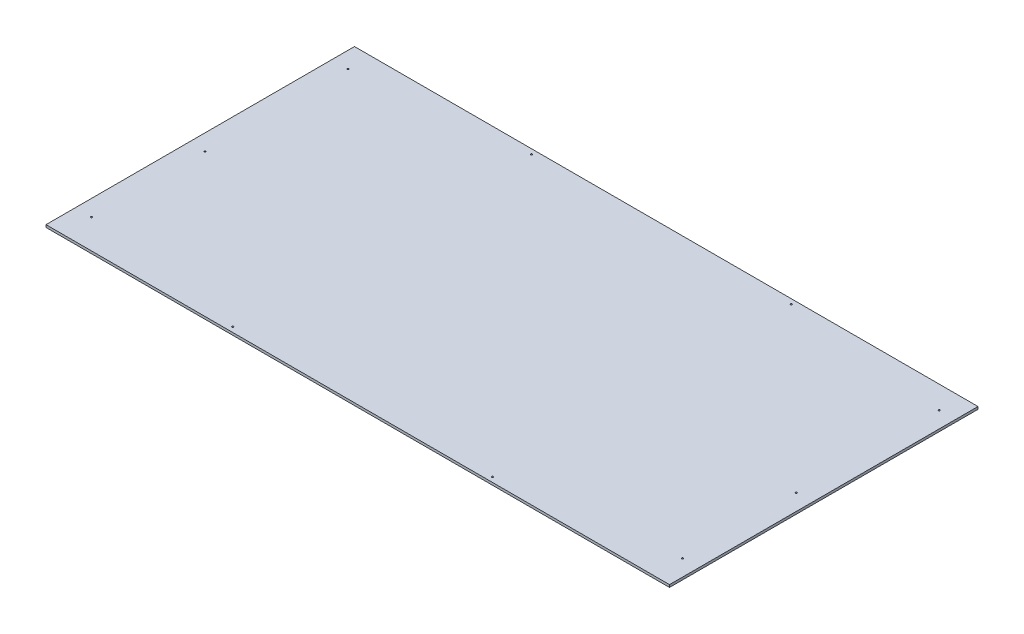
ISO-10303-21;
HEADER;
FILE_DESCRIPTION(('STEP AP214'),'2;1');
FILE_NAME('part.step','',(''),(''),'','','');
FILE_SCHEMA(('AUTOMOTIVE_DESIGN { 1 0 10303 214 1 1 1 1 }'));
ENDSEC;
DATA;
#1=APPLICATION_CONTEXT('core data for automotive mechanical design processes');
#2=APPLICATION_PROTOCOL_DEFINITION('international standard','automotive_design',2000,#1);
#3=PRODUCT_CONTEXT('',#1,'mechanical');
#4=PRODUCT('Part','Part','',(#3));
#5=PRODUCT_RELATED_PRODUCT_CATEGORY('part','',(#4));
#6=PRODUCT_DEFINITION_FORMATION('','',#4);
#7=PRODUCT_DEFINITION_CONTEXT('part definition',#1,'design');
#8=PRODUCT_DEFINITION('design','',#6,#7);
#9=PRODUCT_DEFINITION_SHAPE('','',#8);
#10=(LENGTH_UNIT() NAMED_UNIT(*) SI_UNIT(.MILLI.,.METRE.));
#11=(NAMED_UNIT(*) PLANE_ANGLE_UNIT() SI_UNIT($,.RADIAN.));
#12=(NAMED_UNIT(*) SI_UNIT($,.STERADIAN.) SOLID_ANGLE_UNIT());
#13=UNCERTAINTY_MEASURE_WITH_UNIT(LENGTH_MEASURE(1.E-05),#10,'distance_accuracy_value','');
#14=(GEOMETRIC_REPRESENTATION_CONTEXT(3) GLOBAL_UNCERTAINTY_ASSIGNED_CONTEXT((#13)) GLOBAL_UNIT_ASSIGNED_CONTEXT((#10,
#11,#12)) REPRESENTATION_CONTEXT('',''));
#15=CARTESIAN_POINT('',(0.,0.,0.));
#16=DIRECTION('',(0.,0.,1.));
#17=DIRECTION('',(1.,0.,0.));
#18=AXIS2_PLACEMENT_3D('',#15,#16,#17);
#19=CARTESIAN_POINT('',(0.,42.926,0.));
#20=DIRECTION('',(0.,1.,0.));
#21=DIRECTION('',(0.,0.,1.));
#22=AXIS2_PLACEMENT_3D('',#19,#20,#21);
#23=PLANE('',#22);
#24=CARTESIAN_POINT('',(254.,42.926,473.075));
#25=DIRECTION('',(0.,1.,0.));
#26=DIRECTION('',(0.,0.,1.));
#27=AXIS2_PLACEMENT_3D('',#24,#25,#26);
#28=CIRCLE('',#27,1.5875);
#29=CARTESIAN_POINT('',(254.,42.926,474.6625));
#30=VERTEX_POINT('',#29);
#31=EDGE_CURVE('E109',#30,#30,#28,.F.);
#32=ORIENTED_EDGE('',*,*,#31,.T.);
#33=EDGE_LOOP('',(#32));
#34=FACE_BOUND('',#33,.T.);
#35=CARTESIAN_POINT('',(-254.,42.926,473.075));
#36=DIRECTION('',(0.,1.,0.));
#37=DIRECTION('',(0.,0.,1.));
#38=AXIS2_PLACEMENT_3D('',#35,#36,#37);
#39=CIRCLE('',#38,1.5875);
#40=CARTESIAN_POINT('',(-254.,42.926,474.6625));
#41=VERTEX_POINT('',#40);
#42=EDGE_CURVE('E112',#41,#41,#39,.F.);
#43=ORIENTED_EDGE('',*,*,#42,.T.);
#44=EDGE_LOOP('',(#43));
#45=FACE_BOUND('',#44,.T.);
#46=CARTESIAN_POINT('',(-254.,42.926,1057.275));
#47=DIRECTION('',(0.,1.,0.));
#48=DIRECTION('',(0.,0.,1.));
#49=AXIS2_PLACEMENT_3D('',#46,#47,#48);
#50=CIRCLE('',#49,1.5875);
#51=CARTESIAN_POINT('',(-254.,42.926,1058.8625));
#52=VERTEX_POINT('',#51);
#53=EDGE_CURVE('E115',#52,#52,#50,.F.);
#54=ORIENTED_EDGE('',*,*,#53,.T.);
#55=EDGE_LOOP('',(#54));
#56=FACE_BOUND('',#55,.T.);
#57=CARTESIAN_POINT('',(254.,42.926,1057.275));
#58=DIRECTION('',(0.,1.,0.));
#59=DIRECTION('',(0.,0.,1.));
#60=AXIS2_PLACEMENT_3D('',#57,#58,#59);
#61=CIRCLE('',#60,1.5875);
#62=CARTESIAN_POINT('',(254.,42.926,1058.8625));
#63=VERTEX_POINT('',#62);
#64=EDGE_CURVE('E118',#63,#63,#61,.F.);
#65=ORIENTED_EDGE('',*,*,#64,.T.);
#66=EDGE_LOOP('',(#65));
#67=FACE_BOUND('',#66,.T.);
#68=CARTESIAN_POINT('',(-577.85,42.926,1009.65));
#69=DIRECTION('',(0.,1.,0.));
#70=DIRECTION('',(0.,0.,1.));
#71=AXIS2_PLACEMENT_3D('',#68,#69,#70);
#72=CIRCLE('',#71,1.5875);
#73=CARTESIAN_POINT('',(-577.85,42.926,1011.2375));
#74=VERTEX_POINT('',#73);
#75=EDGE_CURVE('E121',#74,#74,#72,.F.);
#76=ORIENTED_EDGE('',*,*,#75,.T.);
#77=EDGE_LOOP('',(#76));
#78=FACE_BOUND('',#77,.T.);
#79=CARTESIAN_POINT('',(-577.85,42.926,787.4));
#80=DIRECTION('',(0.,1.,0.));
#81=DIRECTION('',(0.,0.,1.));
#82=AXIS2_PLACEMENT_3D('',#79,#80,#81);
#83=CIRCLE('',#82,1.5875);
#84=CARTESIAN_POINT('',(-577.85,42.926,788.9875));
#85=VERTEX_POINT('',#84);
#86=EDGE_CURVE('E124',#85,#85,#83,.F.);
#87=ORIENTED_EDGE('',*,*,#86,.T.);
#88=EDGE_LOOP('',(#87));
#89=FACE_BOUND('',#88,.T.);
#90=CARTESIAN_POINT('',(-577.85,42.926,508.));
#91=DIRECTION('',(0.,1.,0.));
#92=DIRECTION('',(0.,0.,1.));
#93=AXIS2_PLACEMENT_3D('',#90,#91,#92);
#94=CIRCLE('',#93,1.5875);
#95=CARTESIAN_POINT('',(-577.85,42.926,509.5875));
#96=VERTEX_POINT('',#95);
#97=EDGE_CURVE('E127',#96,#96,#94,.F.);
#98=ORIENTED_EDGE('',*,*,#97,.T.);
#99=EDGE_LOOP('',(#98));
#100=FACE_BOUND('',#99,.T.);
#101=CARTESIAN_POINT('',(577.85,42.926,787.4));
#102=DIRECTION('',(0.,1.,0.));
#103=DIRECTION('',(0.,0.,1.));
#104=AXIS2_PLACEMENT_3D('',#101,#102,#103);
#105=CIRCLE('',#104,1.5875);
#106=CARTESIAN_POINT('',(577.85,42.926,788.9875));
#107=VERTEX_POINT('',#106);
#108=EDGE_CURVE('E130',#107,#107,#105,.F.);
#109=ORIENTED_EDGE('',*,*,#108,.T.);
#110=EDGE_LOOP('',(#109));
#111=FACE_BOUND('',#110,.T.);
#112=CARTESIAN_POINT('',(577.85,42.926,508.));
#113=DIRECTION('',(0.,1.,0.));
#114=DIRECTION('',(0.,0.,1.));
#115=AXIS2_PLACEMENT_3D('',#112,#113,#114);
#116=CIRCLE('',#115,1.5875);
#117=CARTESIAN_POINT('',(577.85,42.926,509.5875));
#118=VERTEX_POINT('',#117);
#119=EDGE_CURVE('E132',#118,#118,#116,.F.);
#120=ORIENTED_EDGE('',*,*,#119,.T.);
#121=EDGE_LOOP('',(#120));
#122=FACE_BOUND('',#121,.T.);
#123=CARTESIAN_POINT('',(577.85,42.926,1009.65));
#124=DIRECTION('',(0.,1.,0.));
#125=DIRECTION('',(0.,0.,1.));
#126=AXIS2_PLACEMENT_3D('',#123,#124,#125);
#127=CIRCLE('',#126,1.5875);
#128=CARTESIAN_POINT('',(577.85,42.926,1011.2375));
#129=VERTEX_POINT('',#128);
#130=EDGE_CURVE('E19',#129,#129,#127,.F.);
#131=ORIENTED_EDGE('',*,*,#130,.T.);
#132=EDGE_LOOP('',(#131));
#133=FACE_BOUND('',#132,.T.);
#134=DIRECTION('',(1.,0.,0.));
#135=VECTOR('',#134,1.);
#136=CARTESIAN_POINT('',(-609.6,42.926,1066.8));
#137=LINE('',#136,#135);
#138=CARTESIAN_POINT('',(609.6,42.926,1066.8));
#139=VERTEX_POINT('',#138);
#140=CARTESIAN_POINT('',(-609.6,42.926,1066.8));
#141=VERTEX_POINT('',#140);
#142=EDGE_CURVE('E70',#139,#141,#137,.F.);
#143=ORIENTED_EDGE('',*,*,#142,.F.);
#144=DIRECTION('',(0.,0.,-1.));
#145=VECTOR('',#144,1.);
#146=CARTESIAN_POINT('',(609.6,42.926,1066.8));
#147=LINE('',#146,#145);
#148=CARTESIAN_POINT('',(609.6,42.926,463.55));
#149=VERTEX_POINT('',#148);
#150=EDGE_CURVE('E67',#149,#139,#147,.F.);
#151=ORIENTED_EDGE('',*,*,#150,.F.);
#152=DIRECTION('',(-1.,0.,0.));
#153=VECTOR('',#152,1.);
#154=CARTESIAN_POINT('',(609.6,42.926,463.55));
#155=LINE('',#154,#153);
#156=CARTESIAN_POINT('',(-609.6,42.926,463.55));
#157=VERTEX_POINT('',#156);
#158=EDGE_CURVE('E58',#157,#149,#155,.F.);
#159=ORIENTED_EDGE('',*,*,#158,.F.);
#160=DIRECTION('',(0.,0.,1.));
#161=VECTOR('',#160,1.);
#162=CARTESIAN_POINT('',(-609.6,42.926,463.55));
#163=LINE('',#162,#161);
#164=EDGE_CURVE('E53',#141,#157,#163,.F.);
#165=ORIENTED_EDGE('',*,*,#164,.F.);
#166=EDGE_LOOP('',(#143,#151,#159,#165));
#167=FACE_BOUND('',#166,.T.);
#168=ADVANCED_FACE('F16',(#34,#45,#56,#67,#78,#89,#100,#111,#122,#133,#167),#23,.T.);
#169=CARTESIAN_POINT('',(609.6,38.1,1066.8));
#170=DIRECTION('',(1.,0.,0.));
#171=DIRECTION('',(0.,0.,-1.));
#172=AXIS2_PLACEMENT_3D('',#169,#170,#171);
#173=PLANE('',#172);
#174=DIRECTION('',(0.,1.,0.));
#175=VECTOR('',#174,1.);
#176=CARTESIAN_POINT('',(609.6,38.1,1066.8));
#177=LINE('',#176,#175);
#178=CARTESIAN_POINT('',(609.6,38.1,1066.8));
#179=VERTEX_POINT('',#178);
#180=EDGE_CURVE('E140',#179,#139,#177,.T.);
#181=ORIENTED_EDGE('',*,*,#180,.F.);
#182=DIRECTION('',(0.,0.,1.));
#183=VECTOR('',#182,1.);
#184=CARTESIAN_POINT('',(609.6,38.1,0.));
#185=LINE('',#184,#183);
#186=CARTESIAN_POINT('',(609.6,38.1,463.55));
#187=VERTEX_POINT('',#186);
#188=EDGE_CURVE('E77',#179,#187,#185,.F.);
#189=ORIENTED_EDGE('',*,*,#188,.T.);
#190=DIRECTION('',(0.,1.,0.));
#191=VECTOR('',#190,1.);
#192=CARTESIAN_POINT('',(609.6,38.1,463.55));
#193=LINE('',#192,#191);
#194=EDGE_CURVE('E63',#149,#187,#193,.F.);
#195=ORIENTED_EDGE('',*,*,#194,.F.);
#196=ORIENTED_EDGE('',*,*,#150,.T.);
#197=EDGE_LOOP('',(#181,#189,#195,#196));
#198=FACE_BOUND('',#197,.T.);
#199=ADVANCED_FACE('F76',(#198),#173,.T.);
#200=CARTESIAN_POINT('',(609.6,38.1,463.55));
#201=DIRECTION('',(0.,0.,-1.));
#202=DIRECTION('',(-1.,0.,0.));
#203=AXIS2_PLACEMENT_3D('',#200,#201,#202);
#204=PLANE('',#203);
#205=ORIENTED_EDGE('',*,*,#194,.T.);
#206=DIRECTION('',(1.,0.,0.));
#207=VECTOR('',#206,1.);
#208=CARTESIAN_POINT('',(0.,38.1,463.55));
#209=LINE('',#208,#207);
#210=CARTESIAN_POINT('',(-609.6,38.1,463.55));
#211=VERTEX_POINT('',#210);
#212=EDGE_CURVE('E151',#187,#211,#209,.F.);
#213=ORIENTED_EDGE('',*,*,#212,.T.);
#214=DIRECTION('',(0.,1.,0.));
#215=VECTOR('',#214,1.);
#216=CARTESIAN_POINT('',(-609.6,38.1,463.55));
#217=LINE('',#216,#215);
#218=EDGE_CURVE('E65',#157,#211,#217,.F.);
#219=ORIENTED_EDGE('',*,*,#218,.F.);
#220=ORIENTED_EDGE('',*,*,#158,.T.);
#221=EDGE_LOOP('',(#205,#213,#219,#220));
#222=FACE_BOUND('',#221,.T.);
#223=ADVANCED_FACE('F60',(#222),#204,.T.);
#224=CARTESIAN_POINT('',(-609.6,38.1,463.55));
#225=DIRECTION('',(-1.,0.,0.));
#226=DIRECTION('',(0.,0.,1.));
#227=AXIS2_PLACEMENT_3D('',#224,#225,#226);
#228=PLANE('',#227);
#229=ORIENTED_EDGE('',*,*,#218,.T.);
#230=DIRECTION('',(0.,0.,1.));
#231=VECTOR('',#230,1.);
#232=CARTESIAN_POINT('',(-609.6,38.1,0.));
#233=LINE('',#232,#231);
#234=CARTESIAN_POINT('',(-609.6,38.1,1066.8));
#235=VERTEX_POINT('',#234);
#236=EDGE_CURVE('E148',#211,#235,#233,.T.);
#237=ORIENTED_EDGE('',*,*,#236,.T.);
#238=DIRECTION('',(0.,1.,0.));
#239=VECTOR('',#238,1.);
#240=CARTESIAN_POINT('',(-609.6,38.1,1066.8));
#241=LINE('',#240,#239);
#242=EDGE_CURVE('E34',#141,#235,#241,.F.);
#243=ORIENTED_EDGE('',*,*,#242,.F.);
#244=ORIENTED_EDGE('',*,*,#164,.T.);
#245=EDGE_LOOP('',(#229,#237,#243,#244));
#246=FACE_BOUND('',#245,.T.);
#247=ADVANCED_FACE('F147',(#246),#228,.T.);
#248=CARTESIAN_POINT('',(-609.6,38.1,1066.8));
#249=DIRECTION('',(0.,0.,1.));
#250=DIRECTION('',(1.,0.,0.));
#251=AXIS2_PLACEMENT_3D('',#248,#249,#250);
#252=PLANE('',#251);
#253=ORIENTED_EDGE('',*,*,#242,.T.);
#254=DIRECTION('',(1.,0.,0.));
#255=VECTOR('',#254,1.);
#256=CARTESIAN_POINT('',(0.,38.1,1066.8));
#257=LINE('',#256,#255);
#258=EDGE_CURVE('E108',#235,#179,#257,.T.);
#259=ORIENTED_EDGE('',*,*,#258,.T.);
#260=ORIENTED_EDGE('',*,*,#180,.T.);
#261=ORIENTED_EDGE('',*,*,#142,.T.);
#262=EDGE_LOOP('',(#253,#259,#260,#261));
#263=FACE_BOUND('',#262,.T.);
#264=ADVANCED_FACE('F154',(#263),#252,.T.);
#265=CARTESIAN_POINT('',(577.85,42.926,1009.65));
#266=DIRECTION('',(0.,1.,0.));
#267=DIRECTION('',(0.,0.,1.));
#268=AXIS2_PLACEMENT_3D('',#265,#266,#267);
#269=CYLINDRICAL_SURFACE('',#268,1.5875);
#270=ORIENTED_EDGE('',*,*,#130,.F.);
#271=EDGE_LOOP('',(#270));
#272=FACE_BOUND('',#271,.T.);
#273=CARTESIAN_POINT('',(577.85,38.1,1009.65));
#274=DIRECTION('',(0.,1.,0.));
#275=DIRECTION('',(0.,0.,1.));
#276=AXIS2_PLACEMENT_3D('',#273,#274,#275);
#277=CIRCLE('',#276,1.5875);
#278=CARTESIAN_POINT('',(577.85,38.1,1011.2375));
#279=VERTEX_POINT('',#278);
#280=EDGE_CURVE('E105',#279,#279,#277,.F.);
#281=ORIENTED_EDGE('',*,*,#280,.T.);
#282=EDGE_LOOP('',(#281));
#283=FACE_BOUND('',#282,.T.);
#284=ADVANCED_FACE('F156',(#272,#283),#269,.F.);
#285=CARTESIAN_POINT('',(577.85,42.926,508.));
#286=DIRECTION('',(0.,1.,0.));
#287=DIRECTION('',(0.,0.,1.));
#288=AXIS2_PLACEMENT_3D('',#285,#286,#287);
#289=CYLINDRICAL_SURFACE('',#288,1.5875);
#290=ORIENTED_EDGE('',*,*,#119,.F.);
#291=EDGE_LOOP('',(#290));
#292=FACE_BOUND('',#291,.T.);
#293=CARTESIAN_POINT('',(577.85,38.1,508.));
#294=DIRECTION('',(0.,1.,0.));
#295=DIRECTION('',(0.,0.,1.));
#296=AXIS2_PLACEMENT_3D('',#293,#294,#295);
#297=CIRCLE('',#296,1.5875);
#298=CARTESIAN_POINT('',(577.85,38.1,509.5875));
#299=VERTEX_POINT('',#298);
#300=EDGE_CURVE('E102',#299,#299,#297,.F.);
#301=ORIENTED_EDGE('',*,*,#300,.T.);
#302=EDGE_LOOP('',(#301));
#303=FACE_BOUND('',#302,.T.);
#304=ADVANCED_FACE('F163',(#292,#303),#289,.F.);
#305=CARTESIAN_POINT('',(577.85,42.926,787.4));
#306=DIRECTION('',(0.,1.,0.));
#307=DIRECTION('',(0.,0.,1.));
#308=AXIS2_PLACEMENT_3D('',#305,#306,#307);
#309=CYLINDRICAL_SURFACE('',#308,1.5875);
#310=ORIENTED_EDGE('',*,*,#108,.F.);
#311=EDGE_LOOP('',(#310));
#312=FACE_BOUND('',#311,.T.);
#313=CARTESIAN_POINT('',(577.85,38.1,787.4));
#314=DIRECTION('',(0.,1.,0.));
#315=DIRECTION('',(0.,0.,1.));
#316=AXIS2_PLACEMENT_3D('',#313,#314,#315);
#317=CIRCLE('',#316,1.5875);
#318=CARTESIAN_POINT('',(577.85,38.1,788.9875));
#319=VERTEX_POINT('',#318);
#320=EDGE_CURVE('E99',#319,#319,#317,.F.);
#321=ORIENTED_EDGE('',*,*,#320,.T.);
#322=EDGE_LOOP('',(#321));
#323=FACE_BOUND('',#322,.T.);
#324=ADVANCED_FACE('F202',(#312,#323),#309,.F.);
#325=CARTESIAN_POINT('',(-577.85,42.926,508.));
#326=DIRECTION('',(0.,1.,0.));
#327=DIRECTION('',(0.,0.,1.));
#328=AXIS2_PLACEMENT_3D('',#325,#326,#327);
#329=CYLINDRICAL_SURFACE('',#328,1.5875);
#330=ORIENTED_EDGE('',*,*,#97,.F.);
#331=EDGE_LOOP('',(#330));
#332=FACE_BOUND('',#331,.T.);
#333=CARTESIAN_POINT('',(-577.85,38.1,508.));
#334=DIRECTION('',(0.,1.,0.));
#335=DIRECTION('',(0.,0.,1.));
#336=AXIS2_PLACEMENT_3D('',#333,#334,#335);
#337=CIRCLE('',#336,1.5875);
#338=CARTESIAN_POINT('',(-577.85,38.1,509.5875));
#339=VERTEX_POINT('',#338);
#340=EDGE_CURVE('E96',#339,#339,#337,.F.);
#341=ORIENTED_EDGE('',*,*,#340,.T.);
#342=EDGE_LOOP('',(#341));
#343=FACE_BOUND('',#342,.T.);
#344=ADVANCED_FACE('F198',(#332,#343),#329,.F.);
#345=CARTESIAN_POINT('',(-577.85,42.926,787.4));
#346=DIRECTION('',(0.,1.,0.));
#347=DIRECTION('',(0.,0.,1.));
#348=AXIS2_PLACEMENT_3D('',#345,#346,#347);
#349=CYLINDRICAL_SURFACE('',#348,1.5875);
#350=ORIENTED_EDGE('',*,*,#86,.F.);
#351=EDGE_LOOP('',(#350));
#352=FACE_BOUND('',#351,.T.);
#353=CARTESIAN_POINT('',(-577.85,38.1,787.4));
#354=DIRECTION('',(0.,1.,0.));
#355=DIRECTION('',(0.,0.,1.));
#356=AXIS2_PLACEMENT_3D('',#353,#354,#355);
#357=CIRCLE('',#356,1.5875);
#358=CARTESIAN_POINT('',(-577.85,38.1,788.9875));
#359=VERTEX_POINT('',#358);
#360=EDGE_CURVE('E93',#359,#359,#357,.F.);
#361=ORIENTED_EDGE('',*,*,#360,.T.);
#362=EDGE_LOOP('',(#361));
#363=FACE_BOUND('',#362,.T.);
#364=ADVANCED_FACE('F194',(#352,#363),#349,.F.);
#365=CARTESIAN_POINT('',(-577.85,42.926,1009.65));
#366=DIRECTION('',(0.,1.,0.));
#367=DIRECTION('',(0.,0.,1.));
#368=AXIS2_PLACEMENT_3D('',#365,#366,#367);
#369=CYLINDRICAL_SURFACE('',#368,1.5875);
#370=ORIENTED_EDGE('',*,*,#75,.F.);
#371=EDGE_LOOP('',(#370));
#372=FACE_BOUND('',#371,.T.);
#373=CARTESIAN_POINT('',(-577.85,38.1,1009.65));
#374=DIRECTION('',(0.,1.,0.));
#375=DIRECTION('',(0.,0.,1.));
#376=AXIS2_PLACEMENT_3D('',#373,#374,#375);
#377=CIRCLE('',#376,1.5875);
#378=CARTESIAN_POINT('',(-577.85,38.1,1011.2375));
#379=VERTEX_POINT('',#378);
#380=EDGE_CURVE('E90',#379,#379,#377,.F.);
#381=ORIENTED_EDGE('',*,*,#380,.T.);
#382=EDGE_LOOP('',(#381));
#383=FACE_BOUND('',#382,.T.);
#384=ADVANCED_FACE('F190',(#372,#383),#369,.F.);
#385=CARTESIAN_POINT('',(254.,42.926,1057.275));
#386=DIRECTION('',(0.,1.,0.));
#387=DIRECTION('',(0.,0.,1.));
#388=AXIS2_PLACEMENT_3D('',#385,#386,#387);
#389=CYLINDRICAL_SURFACE('',#388,1.5875);
#390=ORIENTED_EDGE('',*,*,#64,.F.);
#391=EDGE_LOOP('',(#390));
#392=FACE_BOUND('',#391,.T.);
#393=CARTESIAN_POINT('',(254.,38.1,1057.275));
#394=DIRECTION('',(0.,1.,0.));
#395=DIRECTION('',(0.,0.,1.));
#396=AXIS2_PLACEMENT_3D('',#393,#394,#395);
#397=CIRCLE('',#396,1.5875);
#398=CARTESIAN_POINT('',(254.,38.1,1058.8625));
#399=VERTEX_POINT('',#398);
#400=EDGE_CURVE('E87',#399,#399,#397,.F.);
#401=ORIENTED_EDGE('',*,*,#400,.T.);
#402=EDGE_LOOP('',(#401));
#403=FACE_BOUND('',#402,.T.);
#404=ADVANCED_FACE('F186',(#392,#403),#389,.F.);
#405=CARTESIAN_POINT('',(-254.,42.926,1057.275));
#406=DIRECTION('',(0.,1.,0.));
#407=DIRECTION('',(0.,0.,1.));
#408=AXIS2_PLACEMENT_3D('',#405,#406,#407);
#409=CYLINDRICAL_SURFACE('',#408,1.5875);
#410=ORIENTED_EDGE('',*,*,#53,.F.);
#411=EDGE_LOOP('',(#410));
#412=FACE_BOUND('',#411,.T.);
#413=CARTESIAN_POINT('',(-254.,38.1,1057.275));
#414=DIRECTION('',(0.,1.,0.));
#415=DIRECTION('',(0.,0.,1.));
#416=AXIS2_PLACEMENT_3D('',#413,#414,#415);
#417=CIRCLE('',#416,1.5875);
#418=CARTESIAN_POINT('',(-254.,38.1,1058.8625));
#419=VERTEX_POINT('',#418);
#420=EDGE_CURVE('E84',#419,#419,#417,.F.);
#421=ORIENTED_EDGE('',*,*,#420,.T.);
#422=EDGE_LOOP('',(#421));
#423=FACE_BOUND('',#422,.T.);
#424=ADVANCED_FACE('F182',(#412,#423),#409,.F.);
#425=CARTESIAN_POINT('',(-254.,42.926,473.075));
#426=DIRECTION('',(0.,1.,0.));
#427=DIRECTION('',(0.,0.,1.));
#428=AXIS2_PLACEMENT_3D('',#425,#426,#427);
#429=CYLINDRICAL_SURFACE('',#428,1.5875);
#430=ORIENTED_EDGE('',*,*,#42,.F.);
#431=EDGE_LOOP('',(#430));
#432=FACE_BOUND('',#431,.T.);
#433=CARTESIAN_POINT('',(-254.,38.1,473.075));
#434=DIRECTION('',(0.,1.,0.));
#435=DIRECTION('',(0.,0.,1.));
#436=AXIS2_PLACEMENT_3D('',#433,#434,#435);
#437=CIRCLE('',#436,1.5875);
#438=CARTESIAN_POINT('',(-254.,38.1,474.6625));
#439=VERTEX_POINT('',#438);
#440=EDGE_CURVE('E25',#439,#439,#437,.F.);
#441=ORIENTED_EDGE('',*,*,#440,.T.);
#442=EDGE_LOOP('',(#441));
#443=FACE_BOUND('',#442,.T.);
#444=ADVANCED_FACE('F174',(#432,#443),#429,.F.);
#445=CARTESIAN_POINT('',(254.,42.926,473.075));
#446=DIRECTION('',(0.,1.,0.));
#447=DIRECTION('',(0.,0.,1.));
#448=AXIS2_PLACEMENT_3D('',#445,#446,#447);
#449=CYLINDRICAL_SURFACE('',#448,1.5875);
#450=ORIENTED_EDGE('',*,*,#31,.F.);
#451=EDGE_LOOP('',(#450));
#452=FACE_BOUND('',#451,.T.);
#453=CARTESIAN_POINT('',(254.,38.1,473.075));
#454=DIRECTION('',(0.,1.,0.));
#455=DIRECTION('',(0.,0.,1.));
#456=AXIS2_PLACEMENT_3D('',#453,#454,#455);
#457=CIRCLE('',#456,1.5875);
#458=CARTESIAN_POINT('',(254.,38.1,474.6625));
#459=VERTEX_POINT('',#458);
#460=EDGE_CURVE('E11',#459,#459,#457,.F.);
#461=ORIENTED_EDGE('',*,*,#460,.T.);
#462=EDGE_LOOP('',(#461));
#463=FACE_BOUND('',#462,.T.);
#464=ADVANCED_FACE('F168',(#452,#463),#449,.F.);
#465=CARTESIAN_POINT('',(0.,38.1,0.));
#466=DIRECTION('',(0.,1.,0.));
#467=DIRECTION('',(0.,0.,1.));
#468=AXIS2_PLACEMENT_3D('',#465,#466,#467);
#469=PLANE('',#468);
#470=ORIENTED_EDGE('',*,*,#460,.F.);
#471=EDGE_LOOP('',(#470));
#472=FACE_BOUND('',#471,.T.);
#473=ORIENTED_EDGE('',*,*,#440,.F.);
#474=EDGE_LOOP('',(#473));
#475=FACE_BOUND('',#474,.T.);
#476=ORIENTED_EDGE('',*,*,#420,.F.);
#477=EDGE_LOOP('',(#476));
#478=FACE_BOUND('',#477,.T.);
#479=ORIENTED_EDGE('',*,*,#400,.F.);
#480=EDGE_LOOP('',(#479));
#481=FACE_BOUND('',#480,.T.);
#482=ORIENTED_EDGE('',*,*,#380,.F.);
#483=EDGE_LOOP('',(#482));
#484=FACE_BOUND('',#483,.T.);
#485=ORIENTED_EDGE('',*,*,#360,.F.);
#486=EDGE_LOOP('',(#485));
#487=FACE_BOUND('',#486,.T.);
#488=ORIENTED_EDGE('',*,*,#340,.F.);
#489=EDGE_LOOP('',(#488));
#490=FACE_BOUND('',#489,.T.);
#491=ORIENTED_EDGE('',*,*,#320,.F.);
#492=EDGE_LOOP('',(#491));
#493=FACE_BOUND('',#492,.T.);
#494=ORIENTED_EDGE('',*,*,#300,.F.);
#495=EDGE_LOOP('',(#494));
#496=FACE_BOUND('',#495,.T.);
#497=ORIENTED_EDGE('',*,*,#280,.F.);
#498=EDGE_LOOP('',(#497));
#499=FACE_BOUND('',#498,.T.);
#500=ORIENTED_EDGE('',*,*,#236,.F.);
#501=ORIENTED_EDGE('',*,*,#212,.F.);
#502=ORIENTED_EDGE('',*,*,#188,.F.);
#503=ORIENTED_EDGE('',*,*,#258,.F.);
#504=EDGE_LOOP('',(#500,#501,#502,#503));
#505=FACE_BOUND('',#504,.T.);
#506=ADVANCED_FACE('F150',(#472,#475,#478,#481,#484,#487,#490,#493,#496,#499,#505),#469,.F.);
#507=CLOSED_SHELL('',(#168,#199,#223,#247,#264,#284,#304,#324,#344,#364,#384,#404,#424,#444,
#464,#506));
#508=MANIFOLD_SOLID_BREP('B1',#507);
#509=ADVANCED_BREP_SHAPE_REPRESENTATION('',(#18,#508),#14);
#510=SHAPE_DEFINITION_REPRESENTATION(#9,#509);
ENDSEC;
END-ISO-10303-21;
